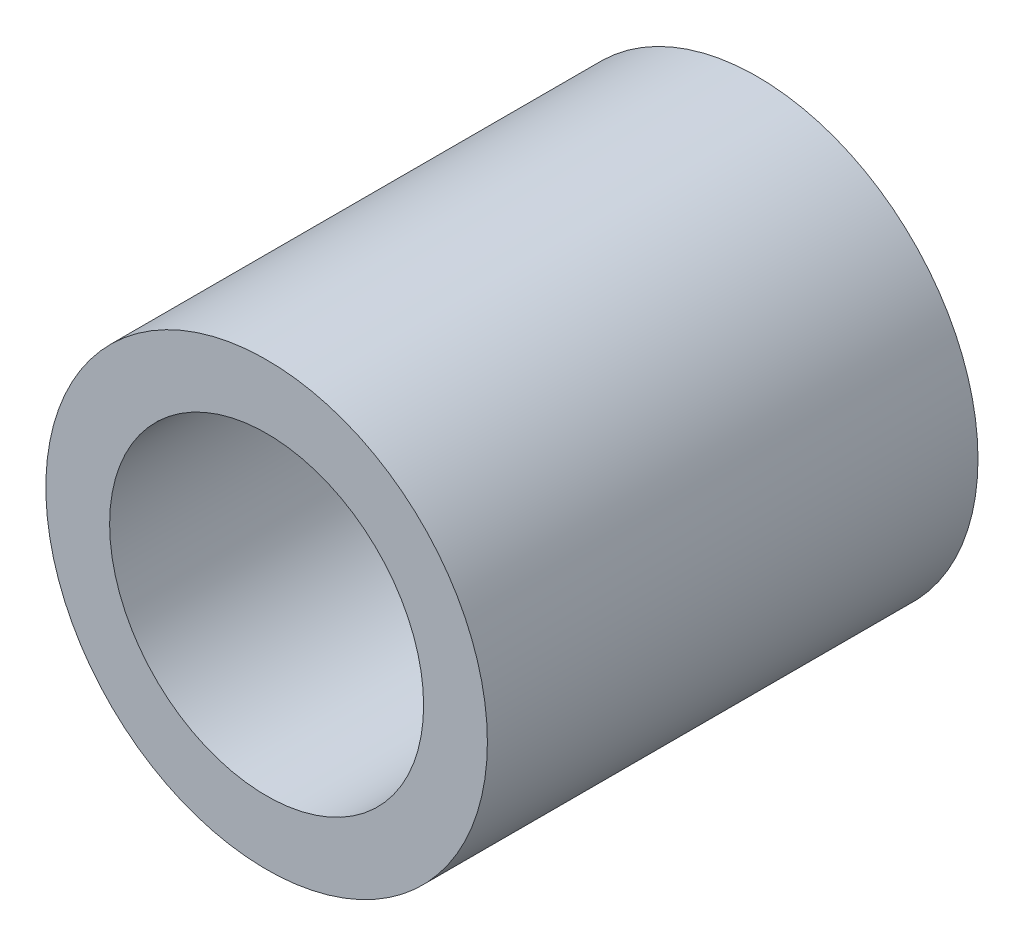
ISO-10303-21;
HEADER;
FILE_DESCRIPTION(('STEP AP214'),'2;1');
FILE_NAME('part.step','',(''),(''),'','','');
FILE_SCHEMA(('AUTOMOTIVE_DESIGN { 1 0 10303 214 1 1 1 1 }'));
ENDSEC;
DATA;
#1=APPLICATION_CONTEXT('core data for automotive mechanical design processes');
#2=APPLICATION_PROTOCOL_DEFINITION('international standard','automotive_design',2000,#1);
#3=PRODUCT_CONTEXT('',#1,'mechanical');
#4=PRODUCT('Part','Part','',(#3));
#5=PRODUCT_RELATED_PRODUCT_CATEGORY('part','',(#4));
#6=PRODUCT_DEFINITION_FORMATION('','',#4);
#7=PRODUCT_DEFINITION_CONTEXT('part definition',#1,'design');
#8=PRODUCT_DEFINITION('design','',#6,#7);
#9=PRODUCT_DEFINITION_SHAPE('','',#8);
#10=(LENGTH_UNIT() NAMED_UNIT(*) SI_UNIT(.MILLI.,.METRE.));
#11=(NAMED_UNIT(*) PLANE_ANGLE_UNIT() SI_UNIT($,.RADIAN.));
#12=(NAMED_UNIT(*) SI_UNIT($,.STERADIAN.) SOLID_ANGLE_UNIT());
#13=UNCERTAINTY_MEASURE_WITH_UNIT(LENGTH_MEASURE(1.E-05),#10,'distance_accuracy_value','');
#14=(GEOMETRIC_REPRESENTATION_CONTEXT(3) GLOBAL_UNCERTAINTY_ASSIGNED_CONTEXT((#13)) GLOBAL_UNIT_ASSIGNED_CONTEXT((#10,
#11,#12)) REPRESENTATION_CONTEXT('',''));
#15=CARTESIAN_POINT('',(0.,0.,0.));
#16=DIRECTION('',(0.,0.,1.));
#17=DIRECTION('',(1.,0.,0.));
#18=AXIS2_PLACEMENT_3D('',#15,#16,#17);
#19=CARTESIAN_POINT('',(0.,0.,2.5));
#20=DIRECTION('',(0.,0.,1.));
#21=DIRECTION('',(1.,0.,0.));
#22=AXIS2_PLACEMENT_3D('',#19,#20,#21);
#23=PLANE('',#22);
#24=CARTESIAN_POINT('',(0.,0.,2.5));
#25=DIRECTION('',(0.,0.,1.));
#26=DIRECTION('',(1.,0.,0.));
#27=AXIS2_PLACEMENT_3D('',#24,#25,#26);
#28=CIRCLE('',#27,2.25);
#29=CARTESIAN_POINT('',(2.25,0.,2.5));
#30=VERTEX_POINT('',#29);
#31=EDGE_CURVE('E10',#30,#30,#28,.T.);
#32=ORIENTED_EDGE('',*,*,#31,.T.);
#33=EDGE_LOOP('',(#32));
#34=FACE_BOUND('',#33,.T.);
#35=CARTESIAN_POINT('',(0.,0.,2.5));
#36=DIRECTION('',(0.,0.,1.));
#37=DIRECTION('',(1.,0.,0.));
#38=AXIS2_PLACEMENT_3D('',#35,#36,#37);
#39=CIRCLE('',#38,1.6);
#40=CARTESIAN_POINT('',(1.6,0.,2.5));
#41=VERTEX_POINT('',#40);
#42=EDGE_CURVE('E41',#41,#41,#39,.T.);
#43=ORIENTED_EDGE('',*,*,#42,.F.);
#44=EDGE_LOOP('',(#43));
#45=FACE_BOUND('',#44,.T.);
#46=ADVANCED_FACE('F30',(#34,#45),#23,.T.);
#47=CARTESIAN_POINT('',(0.,0.,-2.5));
#48=DIRECTION('',(0.,0.,1.));
#49=DIRECTION('',(1.,0.,0.));
#50=AXIS2_PLACEMENT_3D('',#47,#48,#49);
#51=PLANE('',#50);
#52=CARTESIAN_POINT('',(0.,0.,-2.5));
#53=DIRECTION('',(0.,0.,1.));
#54=DIRECTION('',(1.,0.,0.));
#55=AXIS2_PLACEMENT_3D('',#52,#53,#54);
#56=CIRCLE('',#55,2.25);
#57=CARTESIAN_POINT('',(2.25,0.,-2.5));
#58=VERTEX_POINT('',#57);
#59=EDGE_CURVE('E34',#58,#58,#56,.T.);
#60=ORIENTED_EDGE('',*,*,#59,.F.);
#61=EDGE_LOOP('',(#60));
#62=FACE_BOUND('',#61,.T.);
#63=CARTESIAN_POINT('',(0.,0.,-2.5));
#64=DIRECTION('',(0.,0.,1.));
#65=DIRECTION('',(1.,0.,0.));
#66=AXIS2_PLACEMENT_3D('',#63,#64,#65);
#67=CIRCLE('',#66,1.6);
#68=CARTESIAN_POINT('',(1.6,0.,-2.5));
#69=VERTEX_POINT('',#68);
#70=EDGE_CURVE('E43',#69,#69,#67,.T.);
#71=ORIENTED_EDGE('',*,*,#70,.T.);
#72=EDGE_LOOP('',(#71));
#73=FACE_BOUND('',#72,.T.);
#74=ADVANCED_FACE('F53',(#62,#73),#51,.F.);
#75=CARTESIAN_POINT('',(0.,0.,2.5));
#76=DIRECTION('',(0.,0.,-1.));
#77=DIRECTION('',(-1.,0.,0.));
#78=AXIS2_PLACEMENT_3D('',#75,#76,#77);
#79=CYLINDRICAL_SURFACE('',#78,2.25);
#80=ORIENTED_EDGE('',*,*,#31,.F.);
#81=EDGE_LOOP('',(#80));
#82=FACE_BOUND('',#81,.T.);
#83=ORIENTED_EDGE('',*,*,#59,.T.);
#84=EDGE_LOOP('',(#83));
#85=FACE_BOUND('',#84,.T.);
#86=ADVANCED_FACE('F32',(#82,#85),#79,.T.);
#87=CARTESIAN_POINT('',(0.,0.,2.5));
#88=DIRECTION('',(0.,0.,-1.));
#89=DIRECTION('',(-1.,0.,0.));
#90=AXIS2_PLACEMENT_3D('',#87,#88,#89);
#91=CYLINDRICAL_SURFACE('',#90,1.6);
#92=ORIENTED_EDGE('',*,*,#42,.T.);
#93=EDGE_LOOP('',(#92));
#94=FACE_BOUND('',#93,.T.);
#95=ORIENTED_EDGE('',*,*,#70,.F.);
#96=EDGE_LOOP('',(#95));
#97=FACE_BOUND('',#96,.T.);
#98=ADVANCED_FACE('F49',(#94,#97),#91,.F.);
#99=CLOSED_SHELL('',(#46,#74,#86,#98));
#100=MANIFOLD_SOLID_BREP('B2',#99);
#101=ADVANCED_BREP_SHAPE_REPRESENTATION('',(#18,#100),#14);
#102=SHAPE_DEFINITION_REPRESENTATION(#9,#101);
ENDSEC;
END-ISO-10303-21;
